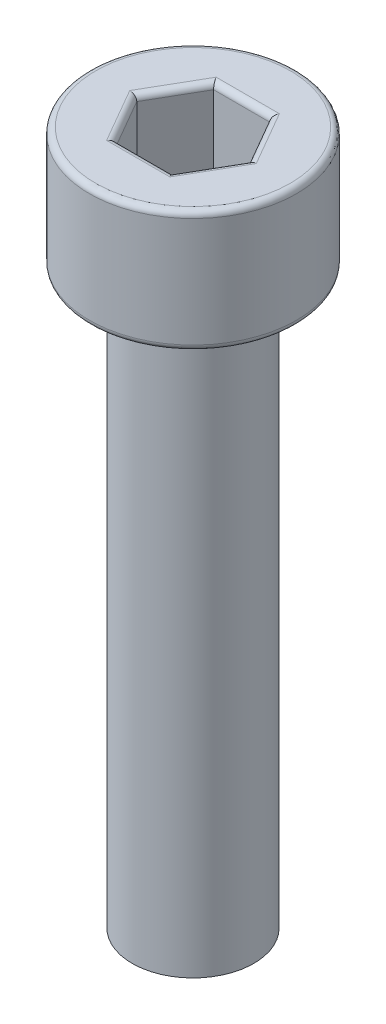
ISO-10303-21;
HEADER;
FILE_DESCRIPTION(('STEP AP214'),'2;1');
FILE_NAME('part.step','',(''),(''),'','','');
FILE_SCHEMA(('AUTOMOTIVE_DESIGN { 1 0 10303 214 1 1 1 1 }'));
ENDSEC;
DATA;
#1=APPLICATION_CONTEXT('core data for automotive mechanical design processes');
#2=APPLICATION_PROTOCOL_DEFINITION('international standard','automotive_design',2000,#1);
#3=PRODUCT_CONTEXT('',#1,'mechanical');
#4=PRODUCT('Part','Part','',(#3));
#5=PRODUCT_RELATED_PRODUCT_CATEGORY('part','',(#4));
#6=PRODUCT_DEFINITION_FORMATION('','',#4);
#7=PRODUCT_DEFINITION_CONTEXT('part definition',#1,'design');
#8=PRODUCT_DEFINITION('design','',#6,#7);
#9=PRODUCT_DEFINITION_SHAPE('','',#8);
#10=(LENGTH_UNIT() NAMED_UNIT(*) SI_UNIT(.MILLI.,.METRE.));
#11=(NAMED_UNIT(*) PLANE_ANGLE_UNIT() SI_UNIT($,.RADIAN.));
#12=(NAMED_UNIT(*) SI_UNIT($,.STERADIAN.) SOLID_ANGLE_UNIT());
#13=UNCERTAINTY_MEASURE_WITH_UNIT(LENGTH_MEASURE(1.E-05),#10,'distance_accuracy_value','');
#14=(GEOMETRIC_REPRESENTATION_CONTEXT(3) GLOBAL_UNCERTAINTY_ASSIGNED_CONTEXT((#13)) GLOBAL_UNIT_ASSIGNED_CONTEXT((#10,
#11,#12)) REPRESENTATION_CONTEXT('',''));
#15=CARTESIAN_POINT('',(0.,0.,0.));
#16=DIRECTION('',(0.,0.,1.));
#17=DIRECTION('',(1.,0.,0.));
#18=AXIS2_PLACEMENT_3D('',#15,#16,#17);
#19=CARTESIAN_POINT('',(2.45056654618361E-11,5.,0.));
#20=DIRECTION('',(0.,-1.,0.));
#21=DIRECTION('',(1.,0.,0.));
#22=AXIS2_PLACEMENT_3D('',#19,#20,#21);
#23=PLANE('',#22);
#24=CARTESIAN_POINT('',(0.,5.,0.));
#25=DIRECTION('',(0.,-1.,0.));
#26=DIRECTION('',(1.,0.,0.));
#27=AXIS2_PLACEMENT_3D('',#24,#25,#26);
#28=CIRCLE('',#27,4.0000000000245);
#29=CARTESIAN_POINT('',(4.0000000000245,5.,0.));
#30=VERTEX_POINT('',#29);
#31=EDGE_CURVE('E179',#30,#30,#28,.F.);
#32=ORIENTED_EDGE('',*,*,#31,.T.);
#33=EDGE_LOOP('',(#32));
#34=FACE_BOUND('',#33,.T.);
#35=DIRECTION('',(-0.5,0.,0.866025403784439));
#36=VECTOR('',#35,1.);
#37=CARTESIAN_POINT('',(-1.94855715850886,5.,-1.12500000001061));
#38=LINE('',#37,#36);
#39=CARTESIAN_POINT('',(-2.59807621135332,5.,0.));
#40=VERTEX_POINT('',#39);
#41=CARTESIAN_POINT('',(-1.29903810567666,5.,-2.25));
#42=VERTEX_POINT('',#41);
#43=EDGE_CURVE('E174',#40,#42,#38,.F.);
#44=ORIENTED_EDGE('',*,*,#43,.T.);
#45=DIRECTION('',(-1.,0.,0.));
#46=VECTOR('',#45,1.);
#47=CARTESIAN_POINT('',(2.45056654618361E-11,5.,-2.25));
#48=LINE('',#47,#46);
#49=CARTESIAN_POINT('',(1.29903810567666,5.,-2.25));
#50=VERTEX_POINT('',#49);
#51=EDGE_CURVE('E176',#42,#50,#48,.F.);
#52=ORIENTED_EDGE('',*,*,#51,.T.);
#53=DIRECTION('',(-0.5,0.,-0.866025403784439));
#54=VECTOR('',#53,1.);
#55=CARTESIAN_POINT('',(1.94855715852111,5.,-1.12499999998939));
#56=LINE('',#55,#54);
#57=CARTESIAN_POINT('',(2.59807621135331,5.,0.));
#58=VERTEX_POINT('',#57);
#59=EDGE_CURVE('E166',#50,#58,#56,.F.);
#60=ORIENTED_EDGE('',*,*,#59,.T.);
#61=DIRECTION('',(0.5,0.,-0.866025403784439));
#62=VECTOR('',#61,1.);
#63=CARTESIAN_POINT('',(1.94855715852111,5.,1.12499999998939));
#64=LINE('',#63,#62);
#65=CARTESIAN_POINT('',(1.29903810567666,5.,2.25));
#66=VERTEX_POINT('',#65);
#67=EDGE_CURVE('E168',#58,#66,#64,.F.);
#68=ORIENTED_EDGE('',*,*,#67,.T.);
#69=DIRECTION('',(1.,0.,0.));
#70=VECTOR('',#69,1.);
#71=CARTESIAN_POINT('',(2.45052429358553E-11,5.,2.25));
#72=LINE('',#71,#70);
#73=CARTESIAN_POINT('',(-1.29903810567666,5.,2.25));
#74=VERTEX_POINT('',#73);
#75=EDGE_CURVE('E170',#66,#74,#72,.F.);
#76=ORIENTED_EDGE('',*,*,#75,.T.);
#77=DIRECTION('',(0.5,0.,0.866025403784439));
#78=VECTOR('',#77,1.);
#79=CARTESIAN_POINT('',(-1.94855715850886,5.,1.12500000001061));
#80=LINE('',#79,#78);
#81=EDGE_CURVE('E172',#74,#40,#80,.F.);
#82=ORIENTED_EDGE('',*,*,#81,.T.);
#83=EDGE_LOOP('',(#44,#52,#60,#68,#76,#82));
#84=FACE_BOUND('',#83,.T.);
#85=ADVANCED_FACE('F33',(#34,#84),#23,.F.);
#86=CARTESIAN_POINT('',(0.,21.3223243250921,0.));
#87=DIRECTION('',(0.,1.,0.));
#88=DIRECTION('',(-1.,0.,0.));
#89=AXIS2_PLACEMENT_3D('',#86,#87,#88);
#90=CYLINDRICAL_SURFACE('',#89,4.2500000000245);
#91=CARTESIAN_POINT('',(0.,0.25,0.));
#92=DIRECTION('',(0.,1.,0.));
#93=DIRECTION('',(-1.,0.,0.));
#94=AXIS2_PLACEMENT_3D('',#91,#92,#93);
#95=CIRCLE('',#94,4.2500000000245);
#96=CARTESIAN_POINT('',(-4.2500000000245,0.25,0.));
#97=VERTEX_POINT('',#96);
#98=EDGE_CURVE('E163',#97,#97,#95,.T.);
#99=ORIENTED_EDGE('',*,*,#98,.T.);
#100=EDGE_LOOP('',(#99));
#101=FACE_BOUND('',#100,.T.);
#102=CARTESIAN_POINT('',(0.,4.75,0.));
#103=DIRECTION('',(0.,-1.,0.));
#104=DIRECTION('',(1.,0.,0.));
#105=AXIS2_PLACEMENT_3D('',#102,#103,#104);
#106=CIRCLE('',#105,4.2500000000245);
#107=CARTESIAN_POINT('',(4.2500000000245,4.75,0.));
#108=VERTEX_POINT('',#107);
#109=EDGE_CURVE('E160',#108,#108,#106,.T.);
#110=ORIENTED_EDGE('',*,*,#109,.T.);
#111=EDGE_LOOP('',(#110));
#112=FACE_BOUND('',#111,.T.);
#113=ADVANCED_FACE('F240',(#101,#112),#90,.T.);
#114=CARTESIAN_POINT('',(4.2500000000245,0.,0.));
#115=DIRECTION('',(0.,1.,0.));
#116=DIRECTION('',(-1.,0.,0.));
#117=AXIS2_PLACEMENT_3D('',#114,#115,#116);
#118=PLANE('',#117);
#119=CARTESIAN_POINT('',(0.,0.,0.));
#120=DIRECTION('',(0.,1.,0.));
#121=DIRECTION('',(-1.,0.,0.));
#122=AXIS2_PLACEMENT_3D('',#119,#120,#121);
#123=CIRCLE('',#122,2.74999999997329);
#124=CARTESIAN_POINT('',(-2.74999999997329,0.,0.));
#125=VERTEX_POINT('',#124);
#126=EDGE_CURVE('E154',#125,#125,#123,.T.);
#127=ORIENTED_EDGE('',*,*,#126,.T.);
#128=EDGE_LOOP('',(#127));
#129=FACE_BOUND('',#128,.T.);
#130=CARTESIAN_POINT('',(0.,0.,0.));
#131=DIRECTION('',(0.,1.,0.));
#132=DIRECTION('',(-1.,0.,0.));
#133=AXIS2_PLACEMENT_3D('',#130,#131,#132);
#134=CIRCLE('',#133,4.0000000000245);
#135=CARTESIAN_POINT('',(-4.0000000000245,0.,0.));
#136=VERTEX_POINT('',#135);
#137=EDGE_CURVE('E151',#136,#136,#134,.F.);
#138=ORIENTED_EDGE('',*,*,#137,.T.);
#139=EDGE_LOOP('',(#138));
#140=FACE_BOUND('',#139,.T.);
#141=ADVANCED_FACE('F246',(#129,#140),#118,.F.);
#142=CARTESIAN_POINT('',(0.,21.3223243250921,0.));
#143=DIRECTION('',(0.,1.,0.));
#144=DIRECTION('',(-1.,0.,0.));
#145=AXIS2_PLACEMENT_3D('',#142,#143,#144);
#146=CYLINDRICAL_SURFACE('',#145,2.49999999997329);
#147=CARTESIAN_POINT('',(0.,-0.25,0.));
#148=DIRECTION('',(0.,1.,0.));
#149=DIRECTION('',(-1.,0.,0.));
#150=AXIS2_PLACEMENT_3D('',#147,#148,#149);
#151=CIRCLE('',#150,2.49999999997329);
#152=CARTESIAN_POINT('',(-2.49999999997329,-0.250000000000001,0.));
#153=VERTEX_POINT('',#152);
#154=EDGE_CURVE('E157',#153,#153,#151,.F.);
#155=ORIENTED_EDGE('',*,*,#154,.T.);
#156=EDGE_LOOP('',(#155));
#157=FACE_BOUND('',#156,.T.);
#158=CARTESIAN_POINT('',(0.,-23.5,0.));
#159=DIRECTION('',(0.,1.,0.));
#160=DIRECTION('',(-1.,0.,0.));
#161=AXIS2_PLACEMENT_3D('',#158,#159,#160);
#162=CIRCLE('',#161,2.49999999997329);
#163=CARTESIAN_POINT('',(-2.49999999997329,-23.5,0.));
#164=VERTEX_POINT('',#163);
#165=EDGE_CURVE('E139',#164,#164,#162,.T.);
#166=ORIENTED_EDGE('',*,*,#165,.T.);
#167=EDGE_LOOP('',(#166));
#168=FACE_BOUND('',#167,.T.);
#169=ADVANCED_FACE('F338',(#157,#168),#146,.T.);
#170=CARTESIAN_POINT('',(2.4999999999733,-23.5,0.));
#171=DIRECTION('',(0.,1.,0.));
#172=DIRECTION('',(-1.,0.,0.));
#173=AXIS2_PLACEMENT_3D('',#170,#171,#172);
#174=PLANE('',#173);
#175=ORIENTED_EDGE('',*,*,#165,.F.);
#176=EDGE_LOOP('',(#175));
#177=FACE_BOUND('',#176,.T.);
#178=ADVANCED_FACE('F236',(#177),#174,.F.);
#179=CARTESIAN_POINT('',(1.15470053837925,1.5,2.));
#180=DIRECTION('',(0.866025403784439,0.,0.5));
#181=DIRECTION('',(0.5,0.,-0.866025403784439));
#182=AXIS2_PLACEMENT_3D('',#179,#180,#181);
#183=PLANE('',#182);
#184=DIRECTION('',(0.,1.,0.));
#185=VECTOR('',#184,1.);
#186=CARTESIAN_POINT('',(1.15470053837925,1.5,2.));
#187=LINE('',#186,#185);
#188=CARTESIAN_POINT('',(1.15470053837925,1.5,2.));
#189=VERTEX_POINT('',#188);
#190=CARTESIAN_POINT('',(1.15470053837925,4.75,2.));
#191=VERTEX_POINT('',#190);
#192=EDGE_CURVE('E137',#189,#191,#187,.T.);
#193=ORIENTED_EDGE('',*,*,#192,.T.);
#194=DIRECTION('',(0.5,0.,-0.866025403784439));
#195=VECTOR('',#194,1.);
#196=CARTESIAN_POINT('',(1.15470053837925,4.75,2.));
#197=LINE('',#196,#195);
#198=CARTESIAN_POINT('',(2.3094010767585,4.75,0.));
#199=VERTEX_POINT('',#198);
#200=EDGE_CURVE('E42',#191,#199,#197,.T.);
#201=ORIENTED_EDGE('',*,*,#200,.T.);
#202=DIRECTION('',(0.,1.,0.));
#203=VECTOR('',#202,1.);
#204=CARTESIAN_POINT('',(2.3094010767585,1.5,0.));
#205=LINE('',#204,#203);
#206=CARTESIAN_POINT('',(2.3094010767585,1.5,0.));
#207=VERTEX_POINT('',#206);
#208=EDGE_CURVE('E103',#207,#199,#205,.T.);
#209=ORIENTED_EDGE('',*,*,#208,.F.);
#210=DIRECTION('',(0.5,0.,-0.866025403784439));
#211=VECTOR('',#210,1.);
#212=CARTESIAN_POINT('',(1.15470053837925,1.5,2.));
#213=LINE('',#212,#211);
#214=EDGE_CURVE('E107',#189,#207,#213,.T.);
#215=ORIENTED_EDGE('',*,*,#214,.F.);
#216=EDGE_LOOP('',(#193,#201,#209,#215));
#217=FACE_BOUND('',#216,.T.);
#218=ADVANCED_FACE('F105',(#217),#183,.F.);
#219=CARTESIAN_POINT('',(-1.15470053837925,1.5,2.));
#220=DIRECTION('',(0.,0.,1.));
#221=DIRECTION('',(1.,0.,0.));
#222=AXIS2_PLACEMENT_3D('',#219,#220,#221);
#223=PLANE('',#222);
#224=DIRECTION('',(0.,1.,0.));
#225=VECTOR('',#224,1.);
#226=CARTESIAN_POINT('',(-1.15470053837925,1.5,2.));
#227=LINE('',#226,#225);
#228=CARTESIAN_POINT('',(-1.15470053837925,1.5,2.));
#229=VERTEX_POINT('',#228);
#230=CARTESIAN_POINT('',(-1.15470053837925,4.75,2.));
#231=VERTEX_POINT('',#230);
#232=EDGE_CURVE('E140',#229,#231,#227,.T.);
#233=ORIENTED_EDGE('',*,*,#232,.T.);
#234=DIRECTION('',(1.,0.,0.));
#235=VECTOR('',#234,1.);
#236=CARTESIAN_POINT('',(-1.15470053837925,4.75,2.));
#237=LINE('',#236,#235);
#238=EDGE_CURVE('E57',#231,#191,#237,.T.);
#239=ORIENTED_EDGE('',*,*,#238,.T.);
#240=ORIENTED_EDGE('',*,*,#192,.F.);
#241=DIRECTION('',(1.,0.,0.));
#242=VECTOR('',#241,1.);
#243=CARTESIAN_POINT('',(-1.15470053837925,1.5,2.));
#244=LINE('',#243,#242);
#245=EDGE_CURVE('E112',#229,#189,#244,.T.);
#246=ORIENTED_EDGE('',*,*,#245,.F.);
#247=EDGE_LOOP('',(#233,#239,#240,#246));
#248=FACE_BOUND('',#247,.T.);
#249=ADVANCED_FACE('F228',(#248),#223,.F.);
#250=CARTESIAN_POINT('',(-2.30940107675851,1.5,0.));
#251=DIRECTION('',(-0.866025403784438,0.,0.5));
#252=DIRECTION('',(0.5,0.,0.866025403784439));
#253=AXIS2_PLACEMENT_3D('',#250,#251,#252);
#254=PLANE('',#253);
#255=DIRECTION('',(0.,1.,0.));
#256=VECTOR('',#255,1.);
#257=CARTESIAN_POINT('',(-2.30940107675851,1.5,0.));
#258=LINE('',#257,#256);
#259=CARTESIAN_POINT('',(-2.30940107675851,1.5,0.));
#260=VERTEX_POINT('',#259);
#261=CARTESIAN_POINT('',(-2.30940107675851,4.75,0.));
#262=VERTEX_POINT('',#261);
#263=EDGE_CURVE('E142',#260,#262,#258,.T.);
#264=ORIENTED_EDGE('',*,*,#263,.T.);
#265=DIRECTION('',(0.5,0.,0.866025403784439));
#266=VECTOR('',#265,1.);
#267=CARTESIAN_POINT('',(-2.30940107675851,4.75,0.));
#268=LINE('',#267,#266);
#269=EDGE_CURVE('E187',#262,#231,#268,.T.);
#270=ORIENTED_EDGE('',*,*,#269,.T.);
#271=ORIENTED_EDGE('',*,*,#232,.F.);
#272=DIRECTION('',(0.5,0.,0.866025403784438));
#273=VECTOR('',#272,1.);
#274=CARTESIAN_POINT('',(-2.30940107675851,1.5,0.));
#275=LINE('',#274,#273);
#276=EDGE_CURVE('E134',#260,#229,#275,.T.);
#277=ORIENTED_EDGE('',*,*,#276,.F.);
#278=EDGE_LOOP('',(#264,#270,#271,#277));
#279=FACE_BOUND('',#278,.T.);
#280=ADVANCED_FACE('F227',(#279),#254,.F.);
#281=CARTESIAN_POINT('',(-1.15470053837925,1.5,-2.));
#282=DIRECTION('',(-0.866025403784438,0.,-0.5));
#283=DIRECTION('',(-0.5,0.,0.866025403784439));
#284=AXIS2_PLACEMENT_3D('',#281,#282,#283);
#285=PLANE('',#284);
#286=DIRECTION('',(0.,1.,0.));
#287=VECTOR('',#286,1.);
#288=CARTESIAN_POINT('',(-1.15470053837925,1.5,-2.));
#289=LINE('',#288,#287);
#290=CARTESIAN_POINT('',(-1.15470053837925,1.5,-2.));
#291=VERTEX_POINT('',#290);
#292=CARTESIAN_POINT('',(-1.15470053837925,4.75,-2.));
#293=VERTEX_POINT('',#292);
#294=EDGE_CURVE('E145',#291,#293,#289,.T.);
#295=ORIENTED_EDGE('',*,*,#294,.T.);
#296=DIRECTION('',(-0.5,0.,0.866025403784439));
#297=VECTOR('',#296,1.);
#298=CARTESIAN_POINT('',(-1.15470053837925,4.75,-2.));
#299=LINE('',#298,#297);
#300=EDGE_CURVE('E185',#293,#262,#299,.T.);
#301=ORIENTED_EDGE('',*,*,#300,.T.);
#302=ORIENTED_EDGE('',*,*,#263,.F.);
#303=DIRECTION('',(-0.5,0.,0.866025403784439));
#304=VECTOR('',#303,1.);
#305=CARTESIAN_POINT('',(-1.15470053837925,1.5,-2.));
#306=LINE('',#305,#304);
#307=EDGE_CURVE('E131',#291,#260,#306,.T.);
#308=ORIENTED_EDGE('',*,*,#307,.F.);
#309=EDGE_LOOP('',(#295,#301,#302,#308));
#310=FACE_BOUND('',#309,.T.);
#311=ADVANCED_FACE('F224',(#310),#285,.F.);
#312=CARTESIAN_POINT('',(1.15470053837925,1.5,-2.));
#313=DIRECTION('',(0.,0.,-1.));
#314=DIRECTION('',(-1.,0.,0.));
#315=AXIS2_PLACEMENT_3D('',#312,#313,#314);
#316=PLANE('',#315);
#317=DIRECTION('',(0.,1.,0.));
#318=VECTOR('',#317,1.);
#319=CARTESIAN_POINT('',(1.15470053837925,1.5,-2.));
#320=LINE('',#319,#318);
#321=CARTESIAN_POINT('',(1.15470053837925,1.5,-2.));
#322=VERTEX_POINT('',#321);
#323=CARTESIAN_POINT('',(1.15470053837925,4.75,-2.));
#324=VERTEX_POINT('',#323);
#325=EDGE_CURVE('E111',#322,#324,#320,.T.);
#326=ORIENTED_EDGE('',*,*,#325,.T.);
#327=DIRECTION('',(-1.,0.,0.));
#328=VECTOR('',#327,1.);
#329=CARTESIAN_POINT('',(1.15470053837925,4.75,-2.));
#330=LINE('',#329,#328);
#331=EDGE_CURVE('E182',#324,#293,#330,.T.);
#332=ORIENTED_EDGE('',*,*,#331,.T.);
#333=ORIENTED_EDGE('',*,*,#294,.F.);
#334=DIRECTION('',(-1.,0.,0.));
#335=VECTOR('',#334,1.);
#336=CARTESIAN_POINT('',(1.15470053837925,1.5,-2.));
#337=LINE('',#336,#335);
#338=EDGE_CURVE('E121',#322,#291,#337,.T.);
#339=ORIENTED_EDGE('',*,*,#338,.F.);
#340=EDGE_LOOP('',(#326,#332,#333,#339));
#341=FACE_BOUND('',#340,.T.);
#342=ADVANCED_FACE('F220',(#341),#316,.F.);
#343=CARTESIAN_POINT('',(2.3094010767585,1.5,0.));
#344=DIRECTION('',(0.866025403784438,0.,-0.5));
#345=DIRECTION('',(-0.5,0.,-0.866025403784439));
#346=AXIS2_PLACEMENT_3D('',#343,#344,#345);
#347=PLANE('',#346);
#348=ORIENTED_EDGE('',*,*,#208,.T.);
#349=DIRECTION('',(-0.5,0.,-0.866025403784439));
#350=VECTOR('',#349,1.);
#351=CARTESIAN_POINT('',(2.3094010767585,4.75,0.));
#352=LINE('',#351,#350);
#353=EDGE_CURVE('E11',#199,#324,#352,.T.);
#354=ORIENTED_EDGE('',*,*,#353,.T.);
#355=ORIENTED_EDGE('',*,*,#325,.F.);
#356=DIRECTION('',(-0.5,0.,-0.866025403784438));
#357=VECTOR('',#356,1.);
#358=CARTESIAN_POINT('',(2.3094010767585,1.5,0.));
#359=LINE('',#358,#357);
#360=EDGE_CURVE('E115',#207,#322,#359,.T.);
#361=ORIENTED_EDGE('',*,*,#360,.F.);
#362=EDGE_LOOP('',(#348,#354,#355,#361));
#363=FACE_BOUND('',#362,.T.);
#364=ADVANCED_FACE('F116',(#363),#347,.F.);
#365=CARTESIAN_POINT('',(0.,1.5,0.));
#366=DIRECTION('',(0.,1.,0.));
#367=DIRECTION('',(0.,0.,1.));
#368=AXIS2_PLACEMENT_3D('',#365,#366,#367);
#369=PLANE('',#368);
#370=ORIENTED_EDGE('',*,*,#214,.T.);
#371=ORIENTED_EDGE('',*,*,#360,.T.);
#372=ORIENTED_EDGE('',*,*,#338,.T.);
#373=ORIENTED_EDGE('',*,*,#307,.T.);
#374=ORIENTED_EDGE('',*,*,#276,.T.);
#375=ORIENTED_EDGE('',*,*,#245,.T.);
#376=EDGE_LOOP('',(#370,#371,#372,#373,#374,#375));
#377=FACE_BOUND('',#376,.T.);
#378=ADVANCED_FACE('F123',(#377),#369,.T.);
#379=CARTESIAN_POINT('',(0.,-0.25,0.));
#380=DIRECTION('',(0.,1.,0.));
#381=DIRECTION('',(-1.,0.,0.));
#382=AXIS2_PLACEMENT_3D('',#379,#380,#381);
#383=TOROIDAL_SURFACE('',#382,2.74999999997329,0.25);
#384=ORIENTED_EDGE('',*,*,#154,.F.);
#385=EDGE_LOOP('',(#384));
#386=FACE_BOUND('',#385,.T.);
#387=ORIENTED_EDGE('',*,*,#126,.F.);
#388=EDGE_LOOP('',(#387));
#389=FACE_BOUND('',#388,.T.);
#390=ADVANCED_FACE('F252',(#386,#389),#383,.F.);
#391=CARTESIAN_POINT('',(0.,0.25,0.));
#392=DIRECTION('',(0.,1.,0.));
#393=DIRECTION('',(-1.,0.,0.));
#394=AXIS2_PLACEMENT_3D('',#391,#392,#393);
#395=TOROIDAL_SURFACE('',#394,4.0000000000245,0.25);
#396=ORIENTED_EDGE('',*,*,#137,.F.);
#397=EDGE_LOOP('',(#396));
#398=FACE_BOUND('',#397,.T.);
#399=ORIENTED_EDGE('',*,*,#98,.F.);
#400=EDGE_LOOP('',(#399));
#401=FACE_BOUND('',#400,.T.);
#402=ADVANCED_FACE('F255',(#398,#401),#395,.T.);
#403=CARTESIAN_POINT('',(0.,4.75,0.));
#404=DIRECTION('',(0.,-1.,0.));
#405=DIRECTION('',(1.,0.,0.));
#406=AXIS2_PLACEMENT_3D('',#403,#404,#405);
#407=TOROIDAL_SURFACE('',#406,4.0000000000245,0.25);
#408=ORIENTED_EDGE('',*,*,#109,.F.);
#409=EDGE_LOOP('',(#408));
#410=FACE_BOUND('',#409,.T.);
#411=ORIENTED_EDGE('',*,*,#31,.F.);
#412=EDGE_LOOP('',(#411));
#413=FACE_BOUND('',#412,.T.);
#414=ADVANCED_FACE('F259',(#410,#413),#407,.T.);
#415=CARTESIAN_POINT('',(-1.15470053837925,4.75,2.25));
#416=DIRECTION('',(1.,0.,0.));
#417=DIRECTION('',(0.,0.,-1.));
#418=AXIS2_PLACEMENT_3D('',#415,#416,#417);
#419=CYLINDRICAL_SURFACE('',#418,0.25);
#420=CARTESIAN_POINT('',(-1.29903810567666,4.75,2.25));
#421=DIRECTION('',(0.866025403784439,0.,0.5));
#422=DIRECTION('',(-0.5,0.,0.866025403784439));
#423=AXIS2_PLACEMENT_3D('',#420,#421,#422);
#424=ELLIPSE('',#423,0.288675134594813,0.25);
#425=EDGE_CURVE('E128',#74,#231,#424,.F.);
#426=ORIENTED_EDGE('',*,*,#425,.F.);
#427=ORIENTED_EDGE('',*,*,#75,.F.);
#428=CARTESIAN_POINT('',(1.29903810567666,4.75,2.25));
#429=DIRECTION('',(0.866025403784438,0.,-0.5));
#430=DIRECTION('',(0.5,0.,0.866025403784439));
#431=AXIS2_PLACEMENT_3D('',#428,#429,#430);
#432=ELLIPSE('',#431,0.288675134594813,0.25);
#433=EDGE_CURVE('E37',#191,#66,#432,.T.);
#434=ORIENTED_EDGE('',*,*,#433,.F.);
#435=ORIENTED_EDGE('',*,*,#238,.F.);
#436=EDGE_LOOP('',(#426,#427,#434,#435));
#437=FACE_BOUND('',#436,.T.);
#438=ADVANCED_FACE('F35',(#437),#419,.T.);
#439=CARTESIAN_POINT('',(1.37120688932536,4.75,2.125));
#440=DIRECTION('',(0.5,0.,-0.866025403784439));
#441=DIRECTION('',(-0.866025403784439,0.,-0.5));
#442=AXIS2_PLACEMENT_3D('',#439,#440,#441);
#443=CYLINDRICAL_SURFACE('',#442,0.25);
#444=ORIENTED_EDGE('',*,*,#433,.T.);
#445=ORIENTED_EDGE('',*,*,#67,.F.);
#446=CARTESIAN_POINT('',(2.59807621135331,4.75,0.));
#447=DIRECTION('',(0.,0.,-1.));
#448=DIRECTION('',(1.,0.,0.));
#449=AXIS2_PLACEMENT_3D('',#446,#447,#448);
#450=ELLIPSE('',#449,0.288675134594813,0.25);
#451=EDGE_CURVE('E198',#199,#58,#450,.T.);
#452=ORIENTED_EDGE('',*,*,#451,.F.);
#453=ORIENTED_EDGE('',*,*,#200,.F.);
#454=EDGE_LOOP('',(#444,#445,#452,#453));
#455=FACE_BOUND('',#454,.T.);
#456=ADVANCED_FACE('F212',(#455),#443,.T.);
#457=CARTESIAN_POINT('',(-2.52590742770462,4.75,0.125));
#458=DIRECTION('',(0.5,0.,0.866025403784439));
#459=DIRECTION('',(0.866025403784438,0.,-0.5));
#460=AXIS2_PLACEMENT_3D('',#457,#458,#459);
#461=CYLINDRICAL_SURFACE('',#460,0.25);
#462=ORIENTED_EDGE('',*,*,#425,.T.);
#463=ORIENTED_EDGE('',*,*,#269,.F.);
#464=CARTESIAN_POINT('',(-2.59807621135332,4.75,0.));
#465=DIRECTION('',(0.,0.,1.));
#466=DIRECTION('',(-1.,0.,0.));
#467=AXIS2_PLACEMENT_3D('',#464,#465,#466);
#468=ELLIPSE('',#467,0.288675134594813,0.25);
#469=EDGE_CURVE('E195',#40,#262,#468,.F.);
#470=ORIENTED_EDGE('',*,*,#469,.F.);
#471=ORIENTED_EDGE('',*,*,#81,.F.);
#472=EDGE_LOOP('',(#462,#463,#470,#471));
#473=FACE_BOUND('',#472,.T.);
#474=ADVANCED_FACE('F205',(#473),#461,.T.);
#475=CARTESIAN_POINT('',(2.52590742770461,4.75,-0.125000000000001));
#476=DIRECTION('',(-0.5,0.,-0.866025403784439));
#477=DIRECTION('',(-0.866025403784438,0.,0.5));
#478=AXIS2_PLACEMENT_3D('',#475,#476,#477);
#479=CYLINDRICAL_SURFACE('',#478,0.25);
#480=ORIENTED_EDGE('',*,*,#451,.T.);
#481=ORIENTED_EDGE('',*,*,#59,.F.);
#482=CARTESIAN_POINT('',(1.29903810567666,4.75,-2.25));
#483=DIRECTION('',(-0.866025403784439,0.,-0.5));
#484=DIRECTION('',(-0.5,0.,0.866025403784439));
#485=AXIS2_PLACEMENT_3D('',#482,#483,#484);
#486=ELLIPSE('',#485,0.288675134594813,0.25);
#487=EDGE_CURVE('E193',#324,#50,#486,.T.);
#488=ORIENTED_EDGE('',*,*,#487,.F.);
#489=ORIENTED_EDGE('',*,*,#353,.F.);
#490=EDGE_LOOP('',(#480,#481,#488,#489));
#491=FACE_BOUND('',#490,.T.);
#492=ADVANCED_FACE('F217',(#491),#479,.T.);
#493=CARTESIAN_POINT('',(-1.37120688932536,4.75,-2.125));
#494=DIRECTION('',(-0.5,0.,0.866025403784439));
#495=DIRECTION('',(0.866025403784438,0.,0.5));
#496=AXIS2_PLACEMENT_3D('',#493,#494,#495);
#497=CYLINDRICAL_SURFACE('',#496,0.25);
#498=ORIENTED_EDGE('',*,*,#469,.T.);
#499=ORIENTED_EDGE('',*,*,#300,.F.);
#500=CARTESIAN_POINT('',(-1.29903810567666,4.75,-2.25));
#501=DIRECTION('',(-0.866025403784439,0.,0.5));
#502=DIRECTION('',(-0.5,0.,-0.866025403784439));
#503=AXIS2_PLACEMENT_3D('',#500,#501,#502);
#504=ELLIPSE('',#503,0.288675134594813,0.25);
#505=EDGE_CURVE('E191',#42,#293,#504,.F.);
#506=ORIENTED_EDGE('',*,*,#505,.F.);
#507=ORIENTED_EDGE('',*,*,#43,.F.);
#508=EDGE_LOOP('',(#498,#499,#506,#507));
#509=FACE_BOUND('',#508,.T.);
#510=ADVANCED_FACE('F267',(#509),#497,.T.);
#511=CARTESIAN_POINT('',(1.15470053837925,4.75,-2.25));
#512=DIRECTION('',(-1.,0.,0.));
#513=DIRECTION('',(0.,-1.,0.));
#514=AXIS2_PLACEMENT_3D('',#511,#512,#513);
#515=CYLINDRICAL_SURFACE('',#514,0.25);
#516=ORIENTED_EDGE('',*,*,#487,.T.);
#517=ORIENTED_EDGE('',*,*,#51,.F.);
#518=ORIENTED_EDGE('',*,*,#505,.T.);
#519=ORIENTED_EDGE('',*,*,#331,.F.);
#520=EDGE_LOOP('',(#516,#517,#518,#519));
#521=FACE_BOUND('',#520,.T.);
#522=ADVANCED_FACE('F264',(#521),#515,.T.);
#523=CLOSED_SHELL('',(#85,#113,#141,#169,#178,#218,#249,#280,#311,#342,#364,#378,#390,#402,#414,
#438,#456,#474,#492,#510,#522));
#524=MANIFOLD_SOLID_BREP('B2',#523);
#525=ADVANCED_BREP_SHAPE_REPRESENTATION('',(#18,#524),#14);
#526=SHAPE_DEFINITION_REPRESENTATION(#9,#525);
ENDSEC;
END-ISO-10303-21;
